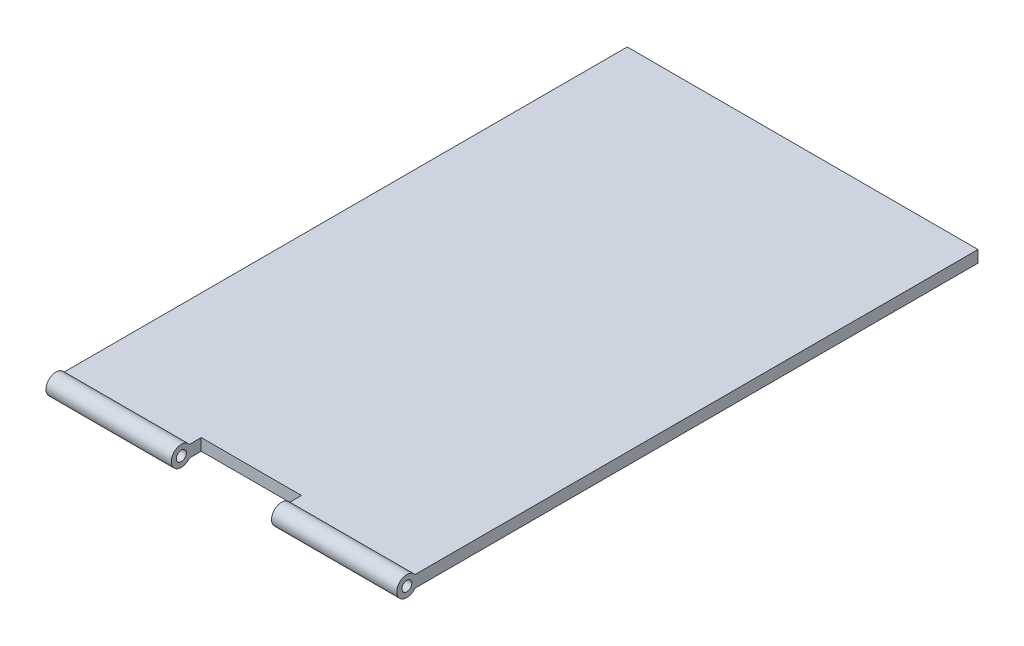
ISO-10303-21;
HEADER;
FILE_DESCRIPTION(('STEP AP214'),'2;1');
FILE_NAME('part.step','',(''),(''),'','','');
FILE_SCHEMA(('AUTOMOTIVE_DESIGN { 1 0 10303 214 1 1 1 1 }'));
ENDSEC;
DATA;
#1=APPLICATION_CONTEXT('core data for automotive mechanical design processes');
#2=APPLICATION_PROTOCOL_DEFINITION('international standard','automotive_design',2000,#1);
#3=PRODUCT_CONTEXT('',#1,'mechanical');
#4=PRODUCT('Part','Part','',(#3));
#5=PRODUCT_RELATED_PRODUCT_CATEGORY('part','',(#4));
#6=PRODUCT_DEFINITION_FORMATION('','',#4);
#7=PRODUCT_DEFINITION_CONTEXT('part definition',#1,'design');
#8=PRODUCT_DEFINITION('design','',#6,#7);
#9=PRODUCT_DEFINITION_SHAPE('','',#8);
#10=(LENGTH_UNIT() NAMED_UNIT(*) SI_UNIT(.MILLI.,.METRE.));
#11=(NAMED_UNIT(*) PLANE_ANGLE_UNIT() SI_UNIT($,.RADIAN.));
#12=(NAMED_UNIT(*) SI_UNIT($,.STERADIAN.) SOLID_ANGLE_UNIT());
#13=UNCERTAINTY_MEASURE_WITH_UNIT(LENGTH_MEASURE(1.E-05),#10,'distance_accuracy_value','');
#14=(GEOMETRIC_REPRESENTATION_CONTEXT(3) GLOBAL_UNCERTAINTY_ASSIGNED_CONTEXT((#13)) GLOBAL_UNIT_ASSIGNED_CONTEXT((#10,
#11,#12)) REPRESENTATION_CONTEXT('',''));
#15=CARTESIAN_POINT('',(0.,0.,0.));
#16=DIRECTION('',(0.,0.,1.));
#17=DIRECTION('',(1.,0.,0.));
#18=AXIS2_PLACEMENT_3D('',#15,#16,#17);
#19=CARTESIAN_POINT('',(-53.5829714592046,1.5,74.899780476051));
#20=DIRECTION('',(1.,0.,0.));
#21=DIRECTION('',(0.,0.,-1.));
#22=AXIS2_PLACEMENT_3D('',#19,#20,#21);
#23=CYLINDRICAL_SURFACE('',#22,2.54);
#24=CARTESIAN_POINT('',(-12.7,1.5,74.899780476051));
#25=DIRECTION('',(-1.,0.,0.));
#26=DIRECTION('',(0.,0.,1.));
#27=AXIS2_PLACEMENT_3D('',#24,#25,#26);
#28=CIRCLE('',#27,2.54);
#29=CARTESIAN_POINT('',(-12.7,2.99999999999999,72.85));
#30=VERTEX_POINT('',#29);
#31=CARTESIAN_POINT('',(-12.7,0.,72.85));
#32=VERTEX_POINT('',#31);
#33=EDGE_CURVE('E111',#30,#32,#28,.F.);
#34=ORIENTED_EDGE('',*,*,#33,.F.);
#35=DIRECTION('',(1.,0.,0.));
#36=VECTOR('',#35,1.);
#37=CARTESIAN_POINT('',(-53.5829714592046,3.,72.85));
#38=LINE('',#37,#36);
#39=CARTESIAN_POINT('',(-44.45,3.,72.85));
#40=VERTEX_POINT('',#39);
#41=EDGE_CURVE('E154',#40,#30,#38,.T.);
#42=ORIENTED_EDGE('',*,*,#41,.F.);
#43=CARTESIAN_POINT('',(-44.45,1.5,74.899780476051));
#44=DIRECTION('',(1.,0.,0.));
#45=DIRECTION('',(0.,0.,-1.));
#46=AXIS2_PLACEMENT_3D('',#43,#44,#45);
#47=CIRCLE('',#46,2.54);
#48=CARTESIAN_POINT('',(-44.45,0.,72.85));
#49=VERTEX_POINT('',#48);
#50=EDGE_CURVE('E143',#49,#40,#47,.F.);
#51=ORIENTED_EDGE('',*,*,#50,.F.);
#52=DIRECTION('',(1.,0.,0.));
#53=VECTOR('',#52,1.);
#54=CARTESIAN_POINT('',(-53.5829714592046,0.,72.85));
#55=LINE('',#54,#53);
#56=EDGE_CURVE('E146',#49,#32,#55,.T.);
#57=ORIENTED_EDGE('',*,*,#56,.T.);
#58=EDGE_LOOP('',(#34,#42,#51,#57));
#59=FACE_BOUND('',#58,.T.);
#60=ADVANCED_FACE('F33',(#59),#23,.T.);
#61=CARTESIAN_POINT('',(-53.5829714592046,1.5,74.899780476051));
#62=DIRECTION('',(1.,0.,0.));
#63=DIRECTION('',(0.,0.,-1.));
#64=AXIS2_PLACEMENT_3D('',#61,#62,#63);
#65=CYLINDRICAL_SURFACE('',#64,1.26999999999999);
#66=CARTESIAN_POINT('',(12.7,1.5,74.899780476051));
#67=DIRECTION('',(1.,0.,0.));
#68=DIRECTION('',(0.,0.,-1.));
#69=AXIS2_PLACEMENT_3D('',#66,#67,#68);
#70=CIRCLE('',#69,1.26999999999999);
#71=CARTESIAN_POINT('',(12.7,1.5,73.6297804760511));
#72=VERTEX_POINT('',#71);
#73=EDGE_CURVE('E133',#72,#72,#70,.F.);
#74=ORIENTED_EDGE('',*,*,#73,.T.);
#75=EDGE_LOOP('',(#74));
#76=FACE_BOUND('',#75,.T.);
#77=CARTESIAN_POINT('',(44.45,1.5,74.899780476051));
#78=DIRECTION('',(1.,0.,0.));
#79=DIRECTION('',(0.,0.,-1.));
#80=AXIS2_PLACEMENT_3D('',#77,#78,#79);
#81=CIRCLE('',#80,1.26999999999999);
#82=CARTESIAN_POINT('',(44.45,1.5,73.629780476051));
#83=VERTEX_POINT('',#82);
#84=EDGE_CURVE('E142',#83,#83,#81,.T.);
#85=ORIENTED_EDGE('',*,*,#84,.T.);
#86=EDGE_LOOP('',(#85));
#87=FACE_BOUND('',#86,.T.);
#88=ADVANCED_FACE('F193',(#76,#87),#65,.F.);
#89=CARTESIAN_POINT('',(44.45,3.,-69.85));
#90=DIRECTION('',(-1.,0.,0.));
#91=DIRECTION('',(0.,0.,1.));
#92=AXIS2_PLACEMENT_3D('',#89,#90,#91);
#93=PLANE('',#92);
#94=DIRECTION('',(0.,0.,-1.));
#95=VECTOR('',#94,1.);
#96=CARTESIAN_POINT('',(44.45,0.,-69.85));
#97=LINE('',#96,#95);
#98=CARTESIAN_POINT('',(44.45,0.,72.85));
#99=VERTEX_POINT('',#98);
#100=CARTESIAN_POINT('',(44.45,0.,-69.85));
#101=VERTEX_POINT('',#100);
#102=EDGE_CURVE('E159',#99,#101,#97,.T.);
#103=ORIENTED_EDGE('',*,*,#102,.T.);
#104=DIRECTION('',(0.,-1.,0.));
#105=VECTOR('',#104,1.);
#106=CARTESIAN_POINT('',(44.45,3.,-69.85));
#107=LINE('',#106,#105);
#108=CARTESIAN_POINT('',(44.45,3.,-69.85));
#109=VERTEX_POINT('',#108);
#110=EDGE_CURVE('E42',#109,#101,#107,.T.);
#111=ORIENTED_EDGE('',*,*,#110,.F.);
#112=DIRECTION('',(0.,0.,-1.));
#113=VECTOR('',#112,1.);
#114=CARTESIAN_POINT('',(44.45,3.,-69.85));
#115=LINE('',#114,#113);
#116=CARTESIAN_POINT('',(44.45,3.,72.85));
#117=VERTEX_POINT('',#116);
#118=EDGE_CURVE('E160',#117,#109,#115,.T.);
#119=ORIENTED_EDGE('',*,*,#118,.F.);
#120=CARTESIAN_POINT('',(44.45,1.5,74.899780476051));
#121=DIRECTION('',(1.,0.,0.));
#122=DIRECTION('',(0.,0.,-1.));
#123=AXIS2_PLACEMENT_3D('',#120,#121,#122);
#124=CIRCLE('',#123,2.54);
#125=EDGE_CURVE('E149',#117,#99,#124,.T.);
#126=ORIENTED_EDGE('',*,*,#125,.T.);
#127=EDGE_LOOP('',(#103,#111,#119,#126));
#128=FACE_BOUND('',#127,.T.);
#129=ORIENTED_EDGE('',*,*,#84,.F.);
#130=EDGE_LOOP('',(#129));
#131=FACE_BOUND('',#130,.T.);
#132=ADVANCED_FACE('F35',(#128,#131),#93,.F.);
#133=CARTESIAN_POINT('',(-44.45,3.,-69.85));
#134=DIRECTION('',(0.,0.,1.));
#135=DIRECTION('',(1.,0.,0.));
#136=AXIS2_PLACEMENT_3D('',#133,#134,#135);
#137=PLANE('',#136);
#138=DIRECTION('',(-1.,0.,0.));
#139=VECTOR('',#138,1.);
#140=CARTESIAN_POINT('',(-44.45,0.,-69.85));
#141=LINE('',#140,#139);
#142=CARTESIAN_POINT('',(-44.45,0.,-69.85));
#143=VERTEX_POINT('',#142);
#144=EDGE_CURVE('E61',#101,#143,#141,.T.);
#145=ORIENTED_EDGE('',*,*,#144,.T.);
#146=DIRECTION('',(0.,-1.,0.));
#147=VECTOR('',#146,1.);
#148=CARTESIAN_POINT('',(-44.45,3.,-69.85));
#149=LINE('',#148,#147);
#150=CARTESIAN_POINT('',(-44.45,3.,-69.85));
#151=VERTEX_POINT('',#150);
#152=EDGE_CURVE('E165',#151,#143,#149,.T.);
#153=ORIENTED_EDGE('',*,*,#152,.F.);
#154=DIRECTION('',(-1.,0.,0.));
#155=VECTOR('',#154,1.);
#156=CARTESIAN_POINT('',(-44.45,3.,-69.85));
#157=LINE('',#156,#155);
#158=EDGE_CURVE('E50',#109,#151,#157,.T.);
#159=ORIENTED_EDGE('',*,*,#158,.F.);
#160=ORIENTED_EDGE('',*,*,#110,.T.);
#161=EDGE_LOOP('',(#145,#153,#159,#160));
#162=FACE_BOUND('',#161,.T.);
#163=ADVANCED_FACE('F185',(#162),#137,.F.);
#164=CARTESIAN_POINT('',(-44.45,3.,-69.85));
#165=DIRECTION('',(1.,0.,0.));
#166=DIRECTION('',(0.,0.,-1.));
#167=AXIS2_PLACEMENT_3D('',#164,#165,#166);
#168=PLANE('',#167);
#169=DIRECTION('',(0.,0.,1.));
#170=VECTOR('',#169,1.);
#171=CARTESIAN_POINT('',(-44.45,0.,-69.85));
#172=LINE('',#171,#170);
#173=EDGE_CURVE('E69',#143,#49,#172,.T.);
#174=ORIENTED_EDGE('',*,*,#173,.T.);
#175=ORIENTED_EDGE('',*,*,#50,.T.);
#176=DIRECTION('',(0.,0.,1.));
#177=VECTOR('',#176,1.);
#178=CARTESIAN_POINT('',(-44.45,3.,-69.85));
#179=LINE('',#178,#177);
#180=EDGE_CURVE('E163',#151,#40,#179,.T.);
#181=ORIENTED_EDGE('',*,*,#180,.F.);
#182=ORIENTED_EDGE('',*,*,#152,.T.);
#183=EDGE_LOOP('',(#174,#175,#181,#182));
#184=FACE_BOUND('',#183,.T.);
#185=CARTESIAN_POINT('',(-44.45,1.5,74.899780476051));
#186=DIRECTION('',(1.,0.,0.));
#187=DIRECTION('',(0.,0.,-1.));
#188=AXIS2_PLACEMENT_3D('',#185,#186,#187);
#189=CIRCLE('',#188,1.26999999999999);
#190=CARTESIAN_POINT('',(-44.45,1.5,73.6297804760511));
#191=VERTEX_POINT('',#190);
#192=EDGE_CURVE('E145',#191,#191,#189,.F.);
#193=ORIENTED_EDGE('',*,*,#192,.F.);
#194=EDGE_LOOP('',(#193));
#195=FACE_BOUND('',#194,.T.);
#196=ADVANCED_FACE('F182',(#184,#195),#168,.F.);
#197=CARTESIAN_POINT('',(0.,3.,0.));
#198=DIRECTION('',(0.,1.,0.));
#199=DIRECTION('',(0.,0.,1.));
#200=AXIS2_PLACEMENT_3D('',#197,#198,#199);
#201=PLANE('',#200);
#202=DIRECTION('',(0.,0.,-1.));
#203=VECTOR('',#202,1.);
#204=CARTESIAN_POINT('',(12.7,3.,0.));
#205=LINE('',#204,#203);
#206=CARTESIAN_POINT('',(12.7,2.99999999999999,72.85));
#207=VERTEX_POINT('',#206);
#208=CARTESIAN_POINT('',(12.7,3.,69.85));
#209=VERTEX_POINT('',#208);
#210=EDGE_CURVE('E135',#207,#209,#205,.T.);
#211=ORIENTED_EDGE('',*,*,#210,.F.);
#212=EDGE_CURVE('E152',#207,#117,#38,.T.);
#213=ORIENTED_EDGE('',*,*,#212,.T.);
#214=ORIENTED_EDGE('',*,*,#118,.T.);
#215=ORIENTED_EDGE('',*,*,#158,.T.);
#216=ORIENTED_EDGE('',*,*,#180,.T.);
#217=ORIENTED_EDGE('',*,*,#41,.T.);
#218=DIRECTION('',(0.,0.,1.));
#219=VECTOR('',#218,1.);
#220=CARTESIAN_POINT('',(-12.7,3.,0.));
#221=LINE('',#220,#219);
#222=CARTESIAN_POINT('',(-12.7,3.,69.85));
#223=VERTEX_POINT('',#222);
#224=EDGE_CURVE('E114',#223,#30,#221,.T.);
#225=ORIENTED_EDGE('',*,*,#224,.F.);
#226=DIRECTION('',(-1.,0.,0.));
#227=VECTOR('',#226,1.);
#228=CARTESIAN_POINT('',(0.,3.,69.85));
#229=LINE('',#228,#227);
#230=EDGE_CURVE('E121',#209,#223,#229,.T.);
#231=ORIENTED_EDGE('',*,*,#230,.F.);
#232=EDGE_LOOP('',(#211,#213,#214,#215,#216,#217,#225,#231));
#233=FACE_BOUND('',#232,.T.);
#234=ADVANCED_FACE('F180',(#233),#201,.T.);
#235=CARTESIAN_POINT('',(0.,0.,0.));
#236=DIRECTION('',(0.,1.,0.));
#237=DIRECTION('',(0.,0.,1.));
#238=AXIS2_PLACEMENT_3D('',#235,#236,#237);
#239=PLANE('',#238);
#240=CARTESIAN_POINT('',(12.7,0.,72.85));
#241=VERTEX_POINT('',#240);
#242=EDGE_CURVE('E130',#241,#99,#55,.T.);
#243=ORIENTED_EDGE('',*,*,#242,.F.);
#244=DIRECTION('',(0.,0.,-1.));
#245=VECTOR('',#244,1.);
#246=CARTESIAN_POINT('',(12.7,0.,0.));
#247=LINE('',#246,#245);
#248=CARTESIAN_POINT('',(12.7,0.,69.85));
#249=VERTEX_POINT('',#248);
#250=EDGE_CURVE('E129',#241,#249,#247,.T.);
#251=ORIENTED_EDGE('',*,*,#250,.T.);
#252=DIRECTION('',(-1.,0.,0.));
#253=VECTOR('',#252,1.);
#254=CARTESIAN_POINT('',(0.,0.,69.85));
#255=LINE('',#254,#253);
#256=CARTESIAN_POINT('',(-12.7,0.,69.85));
#257=VERTEX_POINT('',#256);
#258=EDGE_CURVE('E11',#249,#257,#255,.T.);
#259=ORIENTED_EDGE('',*,*,#258,.T.);
#260=DIRECTION('',(0.,0.,1.));
#261=VECTOR('',#260,1.);
#262=CARTESIAN_POINT('',(-12.7,0.,0.));
#263=LINE('',#262,#261);
#264=EDGE_CURVE('E104',#257,#32,#263,.T.);
#265=ORIENTED_EDGE('',*,*,#264,.T.);
#266=ORIENTED_EDGE('',*,*,#56,.F.);
#267=ORIENTED_EDGE('',*,*,#173,.F.);
#268=ORIENTED_EDGE('',*,*,#144,.F.);
#269=ORIENTED_EDGE('',*,*,#102,.F.);
#270=EDGE_LOOP('',(#243,#251,#259,#265,#266,#267,#268,#269));
#271=FACE_BOUND('',#270,.T.);
#272=ADVANCED_FACE('F127',(#271),#239,.F.);
#273=CARTESIAN_POINT('',(12.7,1.5,74.899780476051));
#274=DIRECTION('',(1.,0.,0.));
#275=DIRECTION('',(0.,0.,-1.));
#276=AXIS2_PLACEMENT_3D('',#273,#274,#275);
#277=CIRCLE('',#276,2.54);
#278=EDGE_CURVE('E132',#241,#207,#277,.F.);
#279=ORIENTED_EDGE('',*,*,#278,.F.);
#280=ORIENTED_EDGE('',*,*,#242,.T.);
#281=ORIENTED_EDGE('',*,*,#125,.F.);
#282=ORIENTED_EDGE('',*,*,#212,.F.);
#283=EDGE_LOOP('',(#279,#280,#281,#282));
#284=FACE_BOUND('',#283,.T.);
#285=ADVANCED_FACE('F191',(#284),#23,.T.);
#286=CARTESIAN_POINT('',(-12.7,1.5,74.899780476051));
#287=DIRECTION('',(-1.,0.,0.));
#288=DIRECTION('',(0.,0.,1.));
#289=AXIS2_PLACEMENT_3D('',#286,#287,#288);
#290=CIRCLE('',#289,1.26999999999999);
#291=CARTESIAN_POINT('',(-12.7,1.5,76.169780476051));
#292=VERTEX_POINT('',#291);
#293=EDGE_CURVE('E122',#292,#292,#290,.F.);
#294=ORIENTED_EDGE('',*,*,#293,.T.);
#295=EDGE_LOOP('',(#294));
#296=FACE_BOUND('',#295,.T.);
#297=ORIENTED_EDGE('',*,*,#192,.T.);
#298=EDGE_LOOP('',(#297));
#299=FACE_BOUND('',#298,.T.);
#300=ADVANCED_FACE('F189',(#296,#299),#65,.F.);
#301=CARTESIAN_POINT('',(-12.7,-1.04,69.85));
#302=DIRECTION('',(0.,0.,-1.));
#303=DIRECTION('',(-1.,0.,0.));
#304=AXIS2_PLACEMENT_3D('',#301,#302,#303);
#305=PLANE('',#304);
#306=ORIENTED_EDGE('',*,*,#230,.T.);
#307=DIRECTION('',(0.,1.,0.));
#308=VECTOR('',#307,1.);
#309=CARTESIAN_POINT('',(-12.7,-1.04,69.85));
#310=LINE('',#309,#308);
#311=EDGE_CURVE('E108',#257,#223,#310,.T.);
#312=ORIENTED_EDGE('',*,*,#311,.F.);
#313=ORIENTED_EDGE('',*,*,#258,.F.);
#314=DIRECTION('',(0.,1.,0.));
#315=VECTOR('',#314,1.);
#316=CARTESIAN_POINT('',(12.7,-1.04,69.85));
#317=LINE('',#316,#315);
#318=EDGE_CURVE('E123',#249,#209,#317,.T.);
#319=ORIENTED_EDGE('',*,*,#318,.T.);
#320=EDGE_LOOP('',(#306,#312,#313,#319));
#321=FACE_BOUND('',#320,.T.);
#322=ADVANCED_FACE('F117',(#321),#305,.F.);
#323=CARTESIAN_POINT('',(12.7,-1.04,69.85));
#324=DIRECTION('',(1.,0.,0.));
#325=DIRECTION('',(0.,0.,-1.));
#326=AXIS2_PLACEMENT_3D('',#323,#324,#325);
#327=PLANE('',#326);
#328=ORIENTED_EDGE('',*,*,#210,.T.);
#329=ORIENTED_EDGE('',*,*,#318,.F.);
#330=ORIENTED_EDGE('',*,*,#250,.F.);
#331=ORIENTED_EDGE('',*,*,#278,.T.);
#332=EDGE_LOOP('',(#328,#329,#330,#331));
#333=FACE_BOUND('',#332,.T.);
#334=ORIENTED_EDGE('',*,*,#73,.F.);
#335=EDGE_LOOP('',(#334));
#336=FACE_BOUND('',#335,.T.);
#337=ADVANCED_FACE('F198',(#333,#336),#327,.F.);
#338=CARTESIAN_POINT('',(-12.7,-1.04,69.85));
#339=DIRECTION('',(-1.,0.,0.));
#340=DIRECTION('',(0.,0.,1.));
#341=AXIS2_PLACEMENT_3D('',#338,#339,#340);
#342=PLANE('',#341);
#343=ORIENTED_EDGE('',*,*,#224,.T.);
#344=ORIENTED_EDGE('',*,*,#33,.T.);
#345=ORIENTED_EDGE('',*,*,#264,.F.);
#346=ORIENTED_EDGE('',*,*,#311,.T.);
#347=EDGE_LOOP('',(#343,#344,#345,#346));
#348=FACE_BOUND('',#347,.T.);
#349=ORIENTED_EDGE('',*,*,#293,.F.);
#350=EDGE_LOOP('',(#349));
#351=FACE_BOUND('',#350,.T.);
#352=ADVANCED_FACE('F106',(#348,#351),#342,.F.);
#353=CLOSED_SHELL('',(#60,#88,#132,#163,#196,#234,#272,#285,#300,#322,#337,#352));
#354=MANIFOLD_SOLID_BREP('B2',#353);
#355=ADVANCED_BREP_SHAPE_REPRESENTATION('',(#18,#354),#14);
#356=SHAPE_DEFINITION_REPRESENTATION(#9,#355);
ENDSEC;
END-ISO-10303-21;
